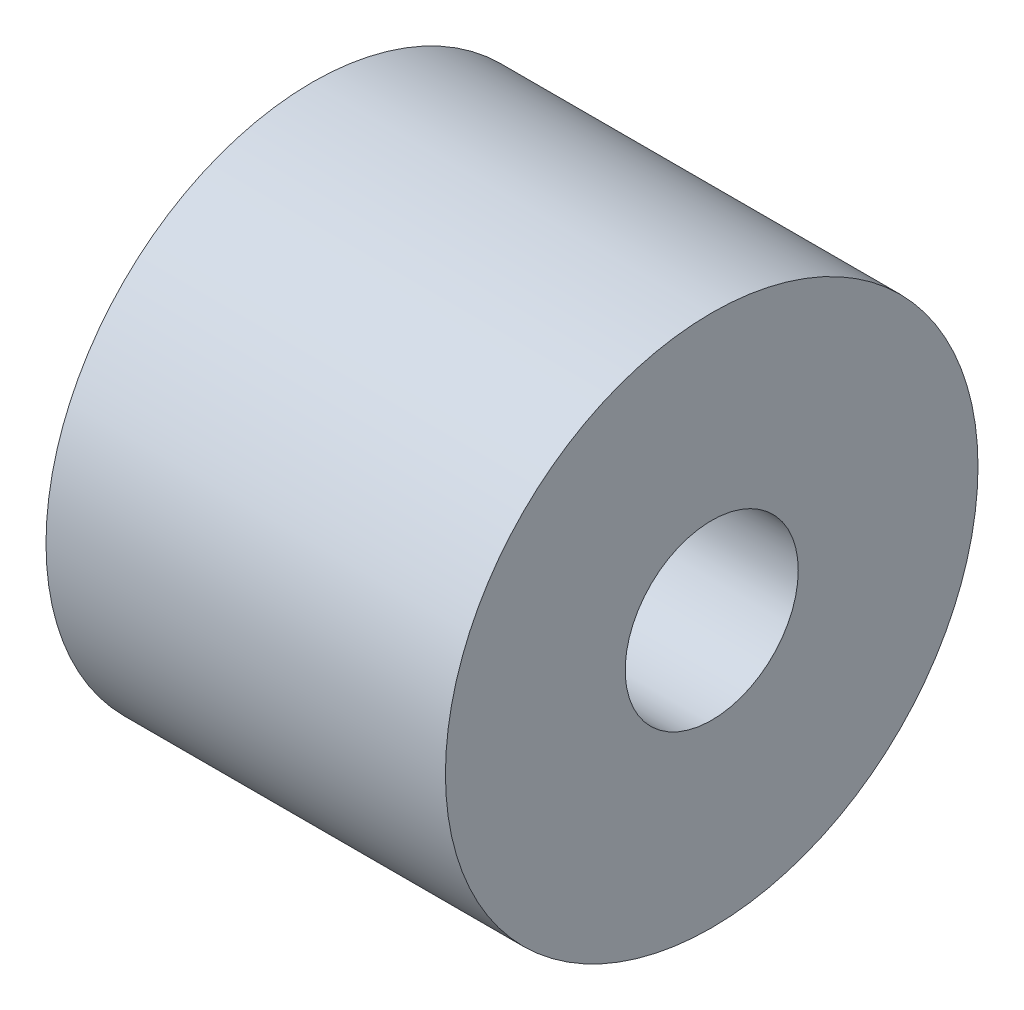
ISO-10303-21;
HEADER;
FILE_DESCRIPTION(('STEP AP214'),'2;1');
FILE_NAME('part.step','',(''),(''),'','','');
FILE_SCHEMA(('AUTOMOTIVE_DESIGN { 1 0 10303 214 1 1 1 1 }'));
ENDSEC;
DATA;
#1=APPLICATION_CONTEXT('core data for automotive mechanical design processes');
#2=APPLICATION_PROTOCOL_DEFINITION('international standard','automotive_design',2000,#1);
#3=PRODUCT_CONTEXT('',#1,'mechanical');
#4=PRODUCT('Part','Part','',(#3));
#5=PRODUCT_RELATED_PRODUCT_CATEGORY('part','',(#4));
#6=PRODUCT_DEFINITION_FORMATION('','',#4);
#7=PRODUCT_DEFINITION_CONTEXT('part definition',#1,'design');
#8=PRODUCT_DEFINITION('design','',#6,#7);
#9=PRODUCT_DEFINITION_SHAPE('','',#8);
#10=(LENGTH_UNIT() NAMED_UNIT(*) SI_UNIT(.MILLI.,.METRE.));
#11=(NAMED_UNIT(*) PLANE_ANGLE_UNIT() SI_UNIT($,.RADIAN.));
#12=(NAMED_UNIT(*) SI_UNIT($,.STERADIAN.) SOLID_ANGLE_UNIT());
#13=UNCERTAINTY_MEASURE_WITH_UNIT(LENGTH_MEASURE(1.E-05),#10,'distance_accuracy_value','');
#14=(GEOMETRIC_REPRESENTATION_CONTEXT(3) GLOBAL_UNCERTAINTY_ASSIGNED_CONTEXT((#13)) GLOBAL_UNIT_ASSIGNED_CONTEXT((#10,
#11,#12)) REPRESENTATION_CONTEXT('',''));
#15=CARTESIAN_POINT('',(0.,0.,0.));
#16=DIRECTION('',(0.,0.,1.));
#17=DIRECTION('',(1.,0.,0.));
#18=AXIS2_PLACEMENT_3D('',#15,#16,#17);
#19=CARTESIAN_POINT('',(15.,0.,0.));
#20=DIRECTION('',(1.,0.,0.));
#21=DIRECTION('',(0.,0.,-1.));
#22=AXIS2_PLACEMENT_3D('',#19,#20,#21);
#23=PLANE('',#22);
#24=CARTESIAN_POINT('',(15.,0.,0.));
#25=DIRECTION('',(1.,0.,0.));
#26=DIRECTION('',(0.,0.,-1.));
#27=AXIS2_PLACEMENT_3D('',#24,#25,#26);
#28=CIRCLE('',#27,10.);
#29=CARTESIAN_POINT('',(15.,0.,-10.));
#30=VERTEX_POINT('',#29);
#31=EDGE_CURVE('E10',#30,#30,#28,.T.);
#32=ORIENTED_EDGE('',*,*,#31,.T.);
#33=EDGE_LOOP('',(#32));
#34=FACE_BOUND('',#33,.T.);
#35=CARTESIAN_POINT('',(15.,0.,0.));
#36=DIRECTION('',(1.,0.,0.));
#37=DIRECTION('',(0.,0.,-1.));
#38=AXIS2_PLACEMENT_3D('',#35,#36,#37);
#39=CIRCLE('',#38,3.25);
#40=CARTESIAN_POINT('',(15.,0.,-3.25));
#41=VERTEX_POINT('',#40);
#42=EDGE_CURVE('E50',#41,#41,#39,.T.);
#43=ORIENTED_EDGE('',*,*,#42,.F.);
#44=EDGE_LOOP('',(#43));
#45=FACE_BOUND('',#44,.T.);
#46=ADVANCED_FACE('F37',(#34,#45),#23,.T.);
#47=CARTESIAN_POINT('',(0.,0.,0.));
#48=DIRECTION('',(1.,0.,0.));
#49=DIRECTION('',(0.,0.,-1.));
#50=AXIS2_PLACEMENT_3D('',#47,#48,#49);
#51=PLANE('',#50);
#52=CARTESIAN_POINT('',(0.,0.,0.));
#53=DIRECTION('',(1.,0.,0.));
#54=DIRECTION('',(0.,0.,-1.));
#55=AXIS2_PLACEMENT_3D('',#52,#53,#54);
#56=CIRCLE('',#55,10.);
#57=CARTESIAN_POINT('',(0.,0.,-10.));
#58=VERTEX_POINT('',#57);
#59=EDGE_CURVE('E41',#58,#58,#56,.T.);
#60=ORIENTED_EDGE('',*,*,#59,.F.);
#61=EDGE_LOOP('',(#60));
#62=FACE_BOUND('',#61,.T.);
#63=CARTESIAN_POINT('',(0.,0.,0.));
#64=DIRECTION('',(1.,0.,0.));
#65=DIRECTION('',(0.,0.,-1.));
#66=AXIS2_PLACEMENT_3D('',#63,#64,#65);
#67=CIRCLE('',#66,3.25);
#68=CARTESIAN_POINT('',(0.,0.,-3.25));
#69=VERTEX_POINT('',#68);
#70=EDGE_CURVE('E52',#69,#69,#67,.T.);
#71=ORIENTED_EDGE('',*,*,#70,.T.);
#72=EDGE_LOOP('',(#71));
#73=FACE_BOUND('',#72,.T.);
#74=ADVANCED_FACE('F64',(#62,#73),#51,.F.);
#75=CARTESIAN_POINT('',(15.,0.,0.));
#76=DIRECTION('',(-1.,0.,0.));
#77=DIRECTION('',(0.,0.,1.));
#78=AXIS2_PLACEMENT_3D('',#75,#76,#77);
#79=CYLINDRICAL_SURFACE('',#78,10.);
#80=ORIENTED_EDGE('',*,*,#31,.F.);
#81=EDGE_LOOP('',(#80));
#82=FACE_BOUND('',#81,.T.);
#83=ORIENTED_EDGE('',*,*,#59,.T.);
#84=EDGE_LOOP('',(#83));
#85=FACE_BOUND('',#84,.T.);
#86=ADVANCED_FACE('F39',(#82,#85),#79,.T.);
#87=CARTESIAN_POINT('',(15.,0.,0.));
#88=DIRECTION('',(-1.,0.,0.));
#89=DIRECTION('',(0.,0.,1.));
#90=AXIS2_PLACEMENT_3D('',#87,#88,#89);
#91=CYLINDRICAL_SURFACE('',#90,3.25);
#92=ORIENTED_EDGE('',*,*,#42,.T.);
#93=EDGE_LOOP('',(#92));
#94=FACE_BOUND('',#93,.T.);
#95=ORIENTED_EDGE('',*,*,#70,.F.);
#96=EDGE_LOOP('',(#95));
#97=FACE_BOUND('',#96,.T.);
#98=ADVANCED_FACE('F60',(#94,#97),#91,.F.);
#99=CLOSED_SHELL('',(#46,#74,#86,#98));
#100=MANIFOLD_SOLID_BREP('B2',#99);
#101=ADVANCED_BREP_SHAPE_REPRESENTATION('',(#18,#100),#14);
#102=SHAPE_DEFINITION_REPRESENTATION(#9,#101);
ENDSEC;
END-ISO-10303-21;
